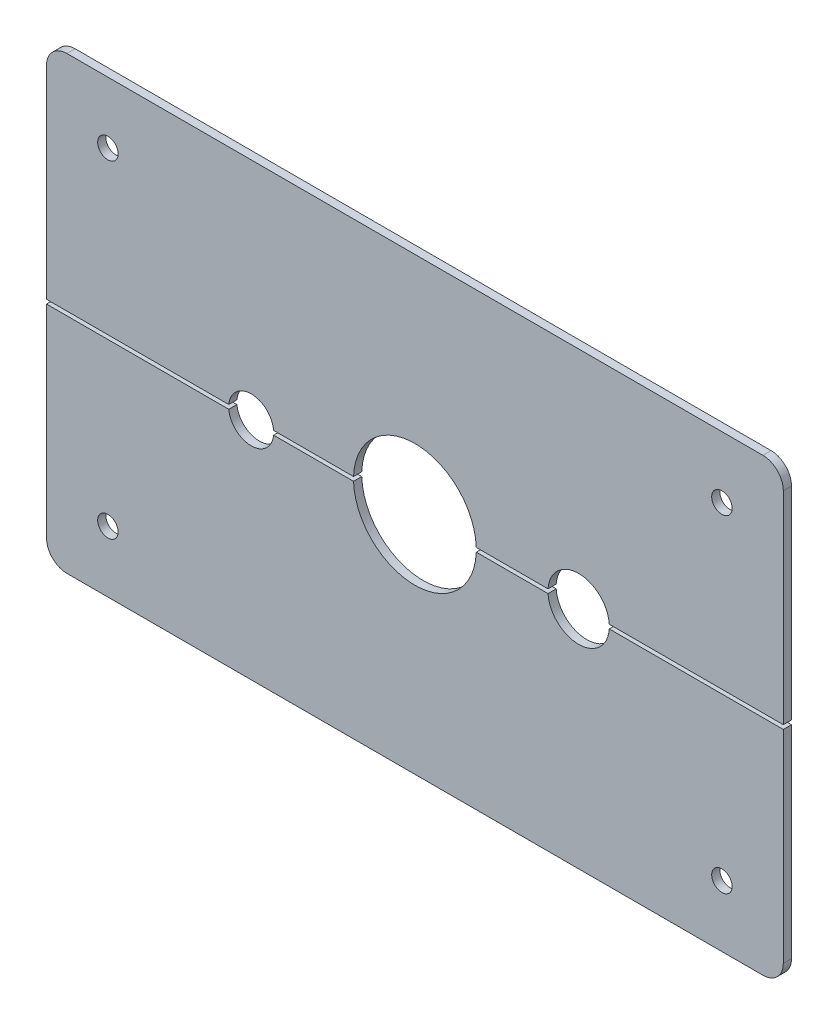
ISO-10303-21;
HEADER;
FILE_DESCRIPTION(('STEP AP214'),'2;1');
FILE_NAME('part.step','',(''),(''),'','','');
FILE_SCHEMA(('AUTOMOTIVE_DESIGN { 1 0 10303 214 1 1 1 1 }'));
ENDSEC;
DATA;
#1=APPLICATION_CONTEXT('core data for automotive mechanical design processes');
#2=APPLICATION_PROTOCOL_DEFINITION('international standard','automotive_design',2000,#1);
#3=PRODUCT_CONTEXT('',#1,'mechanical');
#4=PRODUCT('Part','Part','',(#3));
#5=PRODUCT_RELATED_PRODUCT_CATEGORY('part','',(#4));
#6=PRODUCT_DEFINITION_FORMATION('','',#4);
#7=PRODUCT_DEFINITION_CONTEXT('part definition',#1,'design');
#8=PRODUCT_DEFINITION('design','',#6,#7);
#9=PRODUCT_DEFINITION_SHAPE('','',#8);
#10=(LENGTH_UNIT() NAMED_UNIT(*) SI_UNIT(.MILLI.,.METRE.));
#11=(NAMED_UNIT(*) PLANE_ANGLE_UNIT() SI_UNIT($,.RADIAN.));
#12=(NAMED_UNIT(*) SI_UNIT($,.STERADIAN.) SOLID_ANGLE_UNIT());
#13=UNCERTAINTY_MEASURE_WITH_UNIT(LENGTH_MEASURE(1.E-05),#10,'distance_accuracy_value','');
#14=(GEOMETRIC_REPRESENTATION_CONTEXT(3) GLOBAL_UNCERTAINTY_ASSIGNED_CONTEXT((#13)) GLOBAL_UNIT_ASSIGNED_CONTEXT((#10,
#11,#12)) REPRESENTATION_CONTEXT('',''));
#15=CARTESIAN_POINT('',(0.,0.,0.));
#16=DIRECTION('',(0.,0.,1.));
#17=DIRECTION('',(1.,0.,0.));
#18=AXIS2_PLACEMENT_3D('',#15,#16,#17);
#19=CARTESIAN_POINT('',(-90.,-55.,-2.));
#20=DIRECTION('',(-1.,0.,0.));
#21=DIRECTION('',(0.,0.,1.));
#22=AXIS2_PLACEMENT_3D('',#19,#20,#21);
#23=PLANE('',#22);
#24=DIRECTION('',(0.,0.,1.));
#25=VECTOR('',#24,1.);
#26=CARTESIAN_POINT('',(-90.,-0.5,-2.));
#27=LINE('',#26,#25);
#28=CARTESIAN_POINT('',(-90.,-0.5,-2.));
#29=VERTEX_POINT('',#28);
#30=CARTESIAN_POINT('',(-90.,-0.5,0.));
#31=VERTEX_POINT('',#30);
#32=EDGE_CURVE('E192',#29,#31,#27,.T.);
#33=ORIENTED_EDGE('',*,*,#32,.F.);
#34=DIRECTION('',(0.,-1.,0.));
#35=VECTOR('',#34,1.);
#36=CARTESIAN_POINT('',(-90.,-55.,-2.));
#37=LINE('',#36,#35);
#38=CARTESIAN_POINT('',(-90.,-50.,-2.));
#39=VERTEX_POINT('',#38);
#40=EDGE_CURVE('E205',#29,#39,#37,.T.);
#41=ORIENTED_EDGE('',*,*,#40,.T.);
#42=DIRECTION('',(0.,0.,1.));
#43=VECTOR('',#42,1.);
#44=CARTESIAN_POINT('',(-90.,-50.,-2.));
#45=LINE('',#44,#43);
#46=CARTESIAN_POINT('',(-90.,-50.,0.));
#47=VERTEX_POINT('',#46);
#48=EDGE_CURVE('E147',#39,#47,#45,.T.);
#49=ORIENTED_EDGE('',*,*,#48,.T.);
#50=DIRECTION('',(0.,-1.,0.));
#51=VECTOR('',#50,1.);
#52=CARTESIAN_POINT('',(-90.,-55.,0.));
#53=LINE('',#52,#51);
#54=EDGE_CURVE('E167',#31,#47,#53,.T.);
#55=ORIENTED_EDGE('',*,*,#54,.F.);
#56=EDGE_LOOP('',(#33,#41,#49,#55));
#57=FACE_BOUND('',#56,.T.);
#58=ADVANCED_FACE('F49',(#57),#23,.T.);
#59=CARTESIAN_POINT('',(90.,-55.,-2.));
#60=DIRECTION('',(1.,0.,0.));
#61=DIRECTION('',(0.,0.,-1.));
#62=AXIS2_PLACEMENT_3D('',#59,#60,#61);
#63=PLANE('',#62);
#64=DIRECTION('',(0.,0.,-1.));
#65=VECTOR('',#64,1.);
#66=CARTESIAN_POINT('',(90.,-0.5,-2.));
#67=LINE('',#66,#65);
#68=CARTESIAN_POINT('',(89.9999999999999,-0.5,0.));
#69=VERTEX_POINT('',#68);
#70=CARTESIAN_POINT('',(90.,-0.5,-2.));
#71=VERTEX_POINT('',#70);
#72=EDGE_CURVE('E198',#69,#71,#67,.T.);
#73=ORIENTED_EDGE('',*,*,#72,.F.);
#74=DIRECTION('',(0.,1.,0.));
#75=VECTOR('',#74,1.);
#76=CARTESIAN_POINT('',(90.,-55.,0.));
#77=LINE('',#76,#75);
#78=CARTESIAN_POINT('',(90.,-50.,0.));
#79=VERTEX_POINT('',#78);
#80=EDGE_CURVE('E144',#79,#69,#77,.T.);
#81=ORIENTED_EDGE('',*,*,#80,.F.);
#82=DIRECTION('',(0.,0.,1.));
#83=VECTOR('',#82,1.);
#84=CARTESIAN_POINT('',(90.,-50.,-2.));
#85=LINE('',#84,#83);
#86=CARTESIAN_POINT('',(90.,-50.,-2.));
#87=VERTEX_POINT('',#86);
#88=EDGE_CURVE('E138',#79,#87,#85,.F.);
#89=ORIENTED_EDGE('',*,*,#88,.T.);
#90=DIRECTION('',(0.,1.,0.));
#91=VECTOR('',#90,1.);
#92=CARTESIAN_POINT('',(90.,-55.,-2.));
#93=LINE('',#92,#91);
#94=EDGE_CURVE('E142',#87,#71,#93,.T.);
#95=ORIENTED_EDGE('',*,*,#94,.T.);
#96=EDGE_LOOP('',(#73,#81,#89,#95));
#97=FACE_BOUND('',#96,.T.);
#98=ADVANCED_FACE('F141',(#97),#63,.T.);
#99=CARTESIAN_POINT('',(0.,0.,-2.));
#100=DIRECTION('',(0.,0.,1.));
#101=DIRECTION('',(1.,0.,0.));
#102=AXIS2_PLACEMENT_3D('',#99,#100,#101);
#103=PLANE('',#102);
#104=CARTESIAN_POINT('',(-75.,-40.,-2.));
#105=DIRECTION('',(0.,0.,1.));
#106=DIRECTION('',(1.,0.,0.));
#107=AXIS2_PLACEMENT_3D('',#104,#105,#106);
#108=CIRCLE('',#107,2.50000000000001);
#109=CARTESIAN_POINT('',(-72.5,-40.,-2.));
#110=VERTEX_POINT('',#109);
#111=EDGE_CURVE('E207',#110,#110,#108,.T.);
#112=ORIENTED_EDGE('',*,*,#111,.T.);
#113=EDGE_LOOP('',(#112));
#114=FACE_BOUND('',#113,.T.);
#115=CARTESIAN_POINT('',(75.,-40.,-2.));
#116=DIRECTION('',(0.,0.,1.));
#117=DIRECTION('',(1.,0.,0.));
#118=AXIS2_PLACEMENT_3D('',#115,#116,#117);
#119=CIRCLE('',#118,2.5);
#120=CARTESIAN_POINT('',(77.5,-40.,-2.));
#121=VERTEX_POINT('',#120);
#122=EDGE_CURVE('E256',#121,#121,#119,.T.);
#123=ORIENTED_EDGE('',*,*,#122,.T.);
#124=EDGE_LOOP('',(#123));
#125=FACE_BOUND('',#124,.T.);
#126=ORIENTED_EDGE('',*,*,#40,.F.);
#127=DIRECTION('',(1.,0.,0.));
#128=VECTOR('',#127,1.);
#129=CARTESIAN_POINT('',(0.,-0.5,-2.));
#130=LINE('',#129,#128);
#131=CARTESIAN_POINT('',(-45.4772255750517,-0.5,-2.));
#132=VERTEX_POINT('',#131);
#133=EDGE_CURVE('E158',#29,#132,#130,.T.);
#134=ORIENTED_EDGE('',*,*,#133,.T.);
#135=CARTESIAN_POINT('',(-40.,0.,-2.));
#136=DIRECTION('',(0.,0.,1.));
#137=DIRECTION('',(1.,0.,0.));
#138=AXIS2_PLACEMENT_3D('',#135,#136,#137);
#139=CIRCLE('',#138,5.5);
#140=CARTESIAN_POINT('',(-34.5227744249483,-0.5,-2.));
#141=VERTEX_POINT('',#140);
#142=EDGE_CURVE('E211',#132,#141,#139,.T.);
#143=ORIENTED_EDGE('',*,*,#142,.T.);
#144=CARTESIAN_POINT('',(-14.9916643505649,-0.5,-2.));
#145=VERTEX_POINT('',#144);
#146=EDGE_CURVE('E107',#141,#145,#130,.T.);
#147=ORIENTED_EDGE('',*,*,#146,.T.);
#148=CARTESIAN_POINT('',(0.,0.,-2.));
#149=DIRECTION('',(0.,0.,1.));
#150=DIRECTION('',(1.,0.,0.));
#151=AXIS2_PLACEMENT_3D('',#148,#149,#150);
#152=CIRCLE('',#151,15.);
#153=CARTESIAN_POINT('',(14.9916643505649,-0.5,-2.));
#154=VERTEX_POINT('',#153);
#155=EDGE_CURVE('E203',#145,#154,#152,.T.);
#156=ORIENTED_EDGE('',*,*,#155,.T.);
#157=CARTESIAN_POINT('',(32.5166852264521,-0.5,-2.));
#158=VERTEX_POINT('',#157);
#159=EDGE_CURVE('E171',#154,#158,#130,.T.);
#160=ORIENTED_EDGE('',*,*,#159,.T.);
#161=CARTESIAN_POINT('',(40.,0.,-2.));
#162=DIRECTION('',(0.,0.,1.));
#163=DIRECTION('',(1.,0.,0.));
#164=AXIS2_PLACEMENT_3D('',#161,#162,#163);
#165=CIRCLE('',#164,7.5);
#166=CARTESIAN_POINT('',(47.4833147735479,-0.5,-2.));
#167=VERTEX_POINT('',#166);
#168=EDGE_CURVE('E169',#158,#167,#165,.T.);
#169=ORIENTED_EDGE('',*,*,#168,.T.);
#170=EDGE_CURVE('E157',#167,#71,#130,.T.);
#171=ORIENTED_EDGE('',*,*,#170,.T.);
#172=ORIENTED_EDGE('',*,*,#94,.F.);
#173=CARTESIAN_POINT('',(85.,-50.,-2.));
#174=DIRECTION('',(0.,0.,1.));
#175=DIRECTION('',(1.,0.,0.));
#176=AXIS2_PLACEMENT_3D('',#173,#174,#175);
#177=CIRCLE('',#176,5.);
#178=CARTESIAN_POINT('',(85.,-55.,-2.));
#179=VERTEX_POINT('',#178);
#180=EDGE_CURVE('E154',#87,#179,#177,.F.);
#181=ORIENTED_EDGE('',*,*,#180,.T.);
#182=DIRECTION('',(1.,0.,0.));
#183=VECTOR('',#182,1.);
#184=CARTESIAN_POINT('',(90.,-55.,-2.));
#185=LINE('',#184,#183);
#186=CARTESIAN_POINT('',(-84.9999999999999,-55.,-2.));
#187=VERTEX_POINT('',#186);
#188=EDGE_CURVE('E184',#187,#179,#185,.T.);
#189=ORIENTED_EDGE('',*,*,#188,.F.);
#190=CARTESIAN_POINT('',(-85.,-50.,-2.));
#191=DIRECTION('',(0.,0.,1.));
#192=DIRECTION('',(1.,0.,0.));
#193=AXIS2_PLACEMENT_3D('',#190,#191,#192);
#194=CIRCLE('',#193,5.);
#195=EDGE_CURVE('E164',#187,#39,#194,.F.);
#196=ORIENTED_EDGE('',*,*,#195,.T.);
#197=EDGE_LOOP('',(#126,#134,#143,#147,#156,#160,#169,#171,#172,#181,#189,#196));
#198=FACE_BOUND('',#197,.T.);
#199=ADVANCED_FACE('F152',(#114,#125,#198),#103,.F.);
#200=CARTESIAN_POINT('',(0.,0.,0.));
#201=DIRECTION('',(0.,0.,1.));
#202=DIRECTION('',(1.,0.,0.));
#203=AXIS2_PLACEMENT_3D('',#200,#201,#202);
#204=PLANE('',#203);
#205=CARTESIAN_POINT('',(-75.,-40.,0.));
#206=DIRECTION('',(0.,0.,1.));
#207=DIRECTION('',(1.,0.,0.));
#208=AXIS2_PLACEMENT_3D('',#205,#206,#207);
#209=CIRCLE('',#208,2.50000000000001);
#210=CARTESIAN_POINT('',(-72.5,-40.,0.));
#211=VERTEX_POINT('',#210);
#212=EDGE_CURVE('E259',#211,#211,#209,.T.);
#213=ORIENTED_EDGE('',*,*,#212,.F.);
#214=EDGE_LOOP('',(#213));
#215=FACE_BOUND('',#214,.T.);
#216=CARTESIAN_POINT('',(75.,-40.,0.));
#217=DIRECTION('',(0.,0.,1.));
#218=DIRECTION('',(1.,0.,0.));
#219=AXIS2_PLACEMENT_3D('',#216,#217,#218);
#220=CIRCLE('',#219,2.5);
#221=CARTESIAN_POINT('',(77.5,-40.,0.));
#222=VERTEX_POINT('',#221);
#223=EDGE_CURVE('E260',#222,#222,#220,.T.);
#224=ORIENTED_EDGE('',*,*,#223,.F.);
#225=EDGE_LOOP('',(#224));
#226=FACE_BOUND('',#225,.T.);
#227=DIRECTION('',(1.,0.,0.));
#228=VECTOR('',#227,1.);
#229=CARTESIAN_POINT('',(-112.239777966295,-0.5,0.));
#230=LINE('',#229,#228);
#231=CARTESIAN_POINT('',(-45.4772255750517,-0.5,0.));
#232=VERTEX_POINT('',#231);
#233=EDGE_CURVE('E58',#31,#232,#230,.T.);
#234=ORIENTED_EDGE('',*,*,#233,.F.);
#235=ORIENTED_EDGE('',*,*,#54,.T.);
#236=CARTESIAN_POINT('',(-85.,-50.,0.));
#237=DIRECTION('',(0.,0.,1.));
#238=DIRECTION('',(1.,0.,0.));
#239=AXIS2_PLACEMENT_3D('',#236,#237,#238);
#240=CIRCLE('',#239,5.);
#241=CARTESIAN_POINT('',(-84.9999999999999,-55.,0.));
#242=VERTEX_POINT('',#241);
#243=EDGE_CURVE('E180',#47,#242,#240,.T.);
#244=ORIENTED_EDGE('',*,*,#243,.T.);
#245=DIRECTION('',(1.,0.,0.));
#246=VECTOR('',#245,1.);
#247=CARTESIAN_POINT('',(90.,-55.,0.));
#248=LINE('',#247,#246);
#249=CARTESIAN_POINT('',(85.,-55.,0.));
#250=VERTEX_POINT('',#249);
#251=EDGE_CURVE('E179',#242,#250,#248,.T.);
#252=ORIENTED_EDGE('',*,*,#251,.T.);
#253=CARTESIAN_POINT('',(85.,-50.,0.));
#254=DIRECTION('',(0.,0.,1.));
#255=DIRECTION('',(1.,0.,0.));
#256=AXIS2_PLACEMENT_3D('',#253,#254,#255);
#257=CIRCLE('',#256,5.);
#258=EDGE_CURVE('E176',#250,#79,#257,.T.);
#259=ORIENTED_EDGE('',*,*,#258,.T.);
#260=ORIENTED_EDGE('',*,*,#80,.T.);
#261=CARTESIAN_POINT('',(47.4833147735479,-0.5,0.));
#262=VERTEX_POINT('',#261);
#263=EDGE_CURVE('E195',#262,#69,#230,.T.);
#264=ORIENTED_EDGE('',*,*,#263,.F.);
#265=CARTESIAN_POINT('',(40.,0.,0.));
#266=DIRECTION('',(0.,0.,1.));
#267=DIRECTION('',(1.,0.,0.));
#268=AXIS2_PLACEMENT_3D('',#265,#266,#267);
#269=CIRCLE('',#268,7.5);
#270=CARTESIAN_POINT('',(32.5166852264521,-0.499999999999999,0.));
#271=VERTEX_POINT('',#270);
#272=EDGE_CURVE('E52',#271,#262,#269,.T.);
#273=ORIENTED_EDGE('',*,*,#272,.F.);
#274=CARTESIAN_POINT('',(14.9916643505649,-0.5,0.));
#275=VERTEX_POINT('',#274);
#276=EDGE_CURVE('E60',#275,#271,#230,.T.);
#277=ORIENTED_EDGE('',*,*,#276,.F.);
#278=CARTESIAN_POINT('',(0.,0.,0.));
#279=DIRECTION('',(0.,0.,1.));
#280=DIRECTION('',(1.,0.,0.));
#281=AXIS2_PLACEMENT_3D('',#278,#279,#280);
#282=CIRCLE('',#281,15.);
#283=CARTESIAN_POINT('',(-14.9916643505649,-0.5,0.));
#284=VERTEX_POINT('',#283);
#285=EDGE_CURVE('E201',#284,#275,#282,.T.);
#286=ORIENTED_EDGE('',*,*,#285,.F.);
#287=CARTESIAN_POINT('',(-34.5227744249483,-0.5,0.));
#288=VERTEX_POINT('',#287);
#289=EDGE_CURVE('E12',#288,#284,#230,.T.);
#290=ORIENTED_EDGE('',*,*,#289,.F.);
#291=CARTESIAN_POINT('',(-40.,0.,0.));
#292=DIRECTION('',(0.,0.,1.));
#293=DIRECTION('',(1.,0.,0.));
#294=AXIS2_PLACEMENT_3D('',#291,#292,#293);
#295=CIRCLE('',#294,5.5);
#296=EDGE_CURVE('E188',#232,#288,#295,.T.);
#297=ORIENTED_EDGE('',*,*,#296,.F.);
#298=EDGE_LOOP('',(#234,#235,#244,#252,#259,#260,#264,#273,#277,#286,#290,#297));
#299=FACE_BOUND('',#298,.T.);
#300=ADVANCED_FACE('F224',(#215,#226,#299),#204,.T.);
#301=CARTESIAN_POINT('',(0.,0.,-10.));
#302=DIRECTION('',(0.,0.,1.));
#303=DIRECTION('',(1.,0.,0.));
#304=AXIS2_PLACEMENT_3D('',#301,#302,#303);
#305=CYLINDRICAL_SURFACE('',#304,15.);
#306=ORIENTED_EDGE('',*,*,#285,.T.);
#307=DIRECTION('',(0.,0.,1.));
#308=VECTOR('',#307,1.);
#309=CARTESIAN_POINT('',(14.9916643505649,-0.5,-10.));
#310=LINE('',#309,#308);
#311=EDGE_CURVE('E189',#275,#154,#310,.F.);
#312=ORIENTED_EDGE('',*,*,#311,.T.);
#313=ORIENTED_EDGE('',*,*,#155,.F.);
#314=DIRECTION('',(0.,0.,1.));
#315=VECTOR('',#314,1.);
#316=CARTESIAN_POINT('',(-14.9916643505649,-0.5,-10.));
#317=LINE('',#316,#315);
#318=EDGE_CURVE('E67',#145,#284,#317,.T.);
#319=ORIENTED_EDGE('',*,*,#318,.T.);
#320=EDGE_LOOP('',(#306,#312,#313,#319));
#321=FACE_BOUND('',#320,.T.);
#322=ADVANCED_FACE('F231',(#321),#305,.F.);
#323=CARTESIAN_POINT('',(-40.,0.,-10.));
#324=DIRECTION('',(0.,0.,1.));
#325=DIRECTION('',(1.,0.,0.));
#326=AXIS2_PLACEMENT_3D('',#323,#324,#325);
#327=CYLINDRICAL_SURFACE('',#326,5.5);
#328=ORIENTED_EDGE('',*,*,#296,.T.);
#329=DIRECTION('',(0.,0.,1.));
#330=VECTOR('',#329,1.);
#331=CARTESIAN_POINT('',(-34.5227744249483,-0.5,-10.));
#332=LINE('',#331,#330);
#333=EDGE_CURVE('E104',#288,#141,#332,.F.);
#334=ORIENTED_EDGE('',*,*,#333,.T.);
#335=ORIENTED_EDGE('',*,*,#142,.F.);
#336=DIRECTION('',(0.,0.,1.));
#337=VECTOR('',#336,1.);
#338=CARTESIAN_POINT('',(-45.4772255750517,-0.5,-10.));
#339=LINE('',#338,#337);
#340=EDGE_CURVE('E191',#132,#232,#339,.T.);
#341=ORIENTED_EDGE('',*,*,#340,.T.);
#342=EDGE_LOOP('',(#328,#334,#335,#341));
#343=FACE_BOUND('',#342,.T.);
#344=ADVANCED_FACE('F220',(#343),#327,.F.);
#345=CARTESIAN_POINT('',(40.,0.,-10.));
#346=DIRECTION('',(0.,0.,1.));
#347=DIRECTION('',(1.,0.,0.));
#348=AXIS2_PLACEMENT_3D('',#345,#346,#347);
#349=CYLINDRICAL_SURFACE('',#348,7.5);
#350=ORIENTED_EDGE('',*,*,#272,.T.);
#351=DIRECTION('',(0.,0.,1.));
#352=VECTOR('',#351,1.);
#353=CARTESIAN_POINT('',(47.4833147735479,-0.5,-10.));
#354=LINE('',#353,#352);
#355=EDGE_CURVE('E251',#262,#167,#354,.F.);
#356=ORIENTED_EDGE('',*,*,#355,.T.);
#357=ORIENTED_EDGE('',*,*,#168,.F.);
#358=DIRECTION('',(0.,0.,1.));
#359=VECTOR('',#358,1.);
#360=CARTESIAN_POINT('',(32.5166852264521,-0.5,-10.));
#361=LINE('',#360,#359);
#362=EDGE_CURVE('E186',#158,#271,#361,.T.);
#363=ORIENTED_EDGE('',*,*,#362,.T.);
#364=EDGE_LOOP('',(#350,#356,#357,#363));
#365=FACE_BOUND('',#364,.T.);
#366=ADVANCED_FACE('F312',(#365),#349,.F.);
#367=CARTESIAN_POINT('',(90.,-55.,-2.));
#368=DIRECTION('',(0.,-1.,0.));
#369=DIRECTION('',(1.,0.,0.));
#370=AXIS2_PLACEMENT_3D('',#367,#368,#369);
#371=PLANE('',#370);
#372=ORIENTED_EDGE('',*,*,#188,.T.);
#373=DIRECTION('',(0.,0.,1.));
#374=VECTOR('',#373,1.);
#375=CARTESIAN_POINT('',(85.,-55.,-2.));
#376=LINE('',#375,#374);
#377=EDGE_CURVE('E163',#179,#250,#376,.T.);
#378=ORIENTED_EDGE('',*,*,#377,.T.);
#379=ORIENTED_EDGE('',*,*,#251,.F.);
#380=DIRECTION('',(0.,0.,1.));
#381=VECTOR('',#380,1.);
#382=CARTESIAN_POINT('',(-85.,-55.,-2.));
#383=LINE('',#382,#381);
#384=EDGE_CURVE('E173',#242,#187,#383,.F.);
#385=ORIENTED_EDGE('',*,*,#384,.T.);
#386=EDGE_LOOP('',(#372,#378,#379,#385));
#387=FACE_BOUND('',#386,.T.);
#388=ADVANCED_FACE('F321',(#387),#371,.T.);
#389=CARTESIAN_POINT('',(85.,-50.,-2.));
#390=DIRECTION('',(0.,0.,1.));
#391=DIRECTION('',(1.,0.,0.));
#392=AXIS2_PLACEMENT_3D('',#389,#390,#391);
#393=CYLINDRICAL_SURFACE('',#392,5.);
#394=ORIENTED_EDGE('',*,*,#180,.F.);
#395=ORIENTED_EDGE('',*,*,#88,.F.);
#396=ORIENTED_EDGE('',*,*,#258,.F.);
#397=ORIENTED_EDGE('',*,*,#377,.F.);
#398=EDGE_LOOP('',(#394,#395,#396,#397));
#399=FACE_BOUND('',#398,.T.);
#400=ADVANCED_FACE('F161',(#399),#393,.T.);
#401=CARTESIAN_POINT('',(-85.,-50.,-2.));
#402=DIRECTION('',(0.,0.,1.));
#403=DIRECTION('',(1.,0.,0.));
#404=AXIS2_PLACEMENT_3D('',#401,#402,#403);
#405=CYLINDRICAL_SURFACE('',#404,5.);
#406=ORIENTED_EDGE('',*,*,#195,.F.);
#407=ORIENTED_EDGE('',*,*,#384,.F.);
#408=ORIENTED_EDGE('',*,*,#243,.F.);
#409=ORIENTED_EDGE('',*,*,#48,.F.);
#410=EDGE_LOOP('',(#406,#407,#408,#409));
#411=FACE_BOUND('',#410,.T.);
#412=ADVANCED_FACE('F245',(#411),#405,.T.);
#413=CARTESIAN_POINT('',(-112.239777966295,-0.5,-10.));
#414=DIRECTION('',(0.,-1.,0.));
#415=DIRECTION('',(0.,0.,-1.));
#416=AXIS2_PLACEMENT_3D('',#413,#414,#415);
#417=PLANE('',#416);
#418=ORIENTED_EDGE('',*,*,#276,.T.);
#419=ORIENTED_EDGE('',*,*,#362,.F.);
#420=ORIENTED_EDGE('',*,*,#159,.F.);
#421=ORIENTED_EDGE('',*,*,#311,.F.);
#422=EDGE_LOOP('',(#418,#419,#420,#421));
#423=FACE_BOUND('',#422,.T.);
#424=ADVANCED_FACE('F348',(#423),#417,.F.);
#425=ORIENTED_EDGE('',*,*,#72,.T.);
#426=ORIENTED_EDGE('',*,*,#170,.F.);
#427=ORIENTED_EDGE('',*,*,#355,.F.);
#428=ORIENTED_EDGE('',*,*,#263,.T.);
#429=EDGE_LOOP('',(#425,#426,#427,#428));
#430=FACE_BOUND('',#429,.T.);
#431=ADVANCED_FACE('F357',(#430),#417,.F.);
#432=ORIENTED_EDGE('',*,*,#32,.T.);
#433=ORIENTED_EDGE('',*,*,#233,.T.);
#434=ORIENTED_EDGE('',*,*,#340,.F.);
#435=ORIENTED_EDGE('',*,*,#133,.F.);
#436=EDGE_LOOP('',(#432,#433,#434,#435));
#437=FACE_BOUND('',#436,.T.);
#438=ADVANCED_FACE('F236',(#437),#417,.F.);
#439=ORIENTED_EDGE('',*,*,#146,.F.);
#440=ORIENTED_EDGE('',*,*,#333,.F.);
#441=ORIENTED_EDGE('',*,*,#289,.T.);
#442=ORIENTED_EDGE('',*,*,#318,.F.);
#443=EDGE_LOOP('',(#439,#440,#441,#442));
#444=FACE_BOUND('',#443,.T.);
#445=ADVANCED_FACE('F228',(#444),#417,.F.);
#446=CARTESIAN_POINT('',(75.,-40.,-10.));
#447=DIRECTION('',(0.,0.,1.));
#448=DIRECTION('',(1.,0.,0.));
#449=AXIS2_PLACEMENT_3D('',#446,#447,#448);
#450=CYLINDRICAL_SURFACE('',#449,2.5);
#451=ORIENTED_EDGE('',*,*,#223,.T.);
#452=EDGE_LOOP('',(#451));
#453=FACE_BOUND('',#452,.T.);
#454=ORIENTED_EDGE('',*,*,#122,.F.);
#455=EDGE_LOOP('',(#454));
#456=FACE_BOUND('',#455,.T.);
#457=ADVANCED_FACE('F274',(#453,#456),#450,.F.);
#458=CARTESIAN_POINT('',(-75.,-40.,-10.));
#459=DIRECTION('',(0.,0.,1.));
#460=DIRECTION('',(1.,0.,0.));
#461=AXIS2_PLACEMENT_3D('',#458,#459,#460);
#462=CYLINDRICAL_SURFACE('',#461,2.50000000000001);
#463=ORIENTED_EDGE('',*,*,#212,.T.);
#464=EDGE_LOOP('',(#463));
#465=FACE_BOUND('',#464,.T.);
#466=ORIENTED_EDGE('',*,*,#111,.F.);
#467=EDGE_LOOP('',(#466));
#468=FACE_BOUND('',#467,.T.);
#469=ADVANCED_FACE('F266',(#465,#468),#462,.F.);
#470=CLOSED_SHELL('',(#58,#98,#199,#300,#322,#344,#366,#388,#400,#412,#424,#431,#438,#445,#457,#469));
#471=MANIFOLD_SOLID_BREP('B2',#470);
#472=CARTESIAN_POINT('',(-85.,50.,-2.));
#473=DIRECTION('',(0.,0.,1.));
#474=DIRECTION('',(1.,0.,0.));
#475=AXIS2_PLACEMENT_3D('',#472,#473,#474);
#476=CYLINDRICAL_SURFACE('',#475,5.);
#477=CARTESIAN_POINT('',(-85.,50.,-2.));
#478=DIRECTION('',(0.,0.,1.));
#479=DIRECTION('',(1.,0.,0.));
#480=AXIS2_PLACEMENT_3D('',#477,#478,#479);
#481=CIRCLE('',#480,5.);
#482=CARTESIAN_POINT('',(-90.,50.,-2.));
#483=VERTEX_POINT('',#482);
#484=CARTESIAN_POINT('',(-84.9999999999999,55.,-2.));
#485=VERTEX_POINT('',#484);
#486=EDGE_CURVE('E576',#483,#485,#481,.F.);
#487=ORIENTED_EDGE('',*,*,#486,.F.);
#488=DIRECTION('',(0.,0.,1.));
#489=VECTOR('',#488,1.);
#490=CARTESIAN_POINT('',(-90.,50.,-2.));
#491=LINE('',#490,#489);
#492=CARTESIAN_POINT('',(-90.,50.,0.));
#493=VERTEX_POINT('',#492);
#494=EDGE_CURVE('E581',#493,#483,#491,.F.);
#495=ORIENTED_EDGE('',*,*,#494,.F.);
#496=CARTESIAN_POINT('',(-85.,50.,0.));
#497=DIRECTION('',(0.,0.,1.));
#498=DIRECTION('',(1.,0.,0.));
#499=AXIS2_PLACEMENT_3D('',#496,#497,#498);
#500=CIRCLE('',#499,5.);
#501=CARTESIAN_POINT('',(-84.9999999999999,55.,0.));
#502=VERTEX_POINT('',#501);
#503=EDGE_CURVE('E566',#502,#493,#500,.T.);
#504=ORIENTED_EDGE('',*,*,#503,.F.);
#505=DIRECTION('',(0.,0.,1.));
#506=VECTOR('',#505,1.);
#507=CARTESIAN_POINT('',(-85.,55.,-2.));
#508=LINE('',#507,#506);
#509=EDGE_CURVE('E571',#485,#502,#508,.T.);
#510=ORIENTED_EDGE('',*,*,#509,.F.);
#511=EDGE_LOOP('',(#487,#495,#504,#510));
#512=FACE_BOUND('',#511,.T.);
#513=ADVANCED_FACE('F438',(#512),#476,.T.);
#514=CARTESIAN_POINT('',(90.,55.,-2.));
#515=DIRECTION('',(0.,1.,0.));
#516=DIRECTION('',(-1.,0.,0.));
#517=AXIS2_PLACEMENT_3D('',#514,#515,#516);
#518=PLANE('',#517);
#519=DIRECTION('',(-1.,0.,0.));
#520=VECTOR('',#519,1.);
#521=CARTESIAN_POINT('',(90.,55.,0.));
#522=LINE('',#521,#520);
#523=CARTESIAN_POINT('',(85.,55.,0.));
#524=VERTEX_POINT('',#523);
#525=EDGE_CURVE('E554',#524,#502,#522,.T.);
#526=ORIENTED_EDGE('',*,*,#525,.F.);
#527=DIRECTION('',(0.,0.,1.));
#528=VECTOR('',#527,1.);
#529=CARTESIAN_POINT('',(85.,55.,-2.));
#530=LINE('',#529,#528);
#531=CARTESIAN_POINT('',(85.,55.,-2.));
#532=VERTEX_POINT('',#531);
#533=EDGE_CURVE('E574',#524,#532,#530,.F.);
#534=ORIENTED_EDGE('',*,*,#533,.T.);
#535=DIRECTION('',(-1.,0.,0.));
#536=VECTOR('',#535,1.);
#537=CARTESIAN_POINT('',(90.,55.,-2.));
#538=LINE('',#537,#536);
#539=EDGE_CURVE('E567',#532,#485,#538,.T.);
#540=ORIENTED_EDGE('',*,*,#539,.T.);
#541=ORIENTED_EDGE('',*,*,#509,.T.);
#542=EDGE_LOOP('',(#526,#534,#540,#541));
#543=FACE_BOUND('',#542,.T.);
#544=ADVANCED_FACE('F634',(#543),#518,.T.);
#545=CARTESIAN_POINT('',(85.,50.,-2.));
#546=DIRECTION('',(0.,0.,1.));
#547=DIRECTION('',(1.,0.,0.));
#548=AXIS2_PLACEMENT_3D('',#545,#546,#547);
#549=CYLINDRICAL_SURFACE('',#548,5.);
#550=CARTESIAN_POINT('',(85.,50.,-2.));
#551=DIRECTION('',(0.,0.,1.));
#552=DIRECTION('',(1.,0.,0.));
#553=AXIS2_PLACEMENT_3D('',#550,#551,#552);
#554=CIRCLE('',#553,5.);
#555=CARTESIAN_POINT('',(90.,50.,-2.));
#556=VERTEX_POINT('',#555);
#557=EDGE_CURVE('E578',#532,#556,#554,.F.);
#558=ORIENTED_EDGE('',*,*,#557,.F.);
#559=ORIENTED_EDGE('',*,*,#533,.F.);
#560=CARTESIAN_POINT('',(85.,50.,0.));
#561=DIRECTION('',(0.,0.,1.));
#562=DIRECTION('',(1.,0.,0.));
#563=AXIS2_PLACEMENT_3D('',#560,#561,#562);
#564=CIRCLE('',#563,5.);
#565=CARTESIAN_POINT('',(90.,50.,0.));
#566=VERTEX_POINT('',#565);
#567=EDGE_CURVE('E569',#566,#524,#564,.T.);
#568=ORIENTED_EDGE('',*,*,#567,.F.);
#569=DIRECTION('',(0.,0.,1.));
#570=VECTOR('',#569,1.);
#571=CARTESIAN_POINT('',(90.,50.,-2.));
#572=LINE('',#571,#570);
#573=EDGE_CURVE('E553',#556,#566,#572,.T.);
#574=ORIENTED_EDGE('',*,*,#573,.F.);
#575=EDGE_LOOP('',(#558,#559,#568,#574));
#576=FACE_BOUND('',#575,.T.);
#577=ADVANCED_FACE('F664',(#576),#549,.T.);
#578=CARTESIAN_POINT('',(40.,0.,-10.));
#579=DIRECTION('',(0.,0.,1.));
#580=DIRECTION('',(1.,0.,0.));
#581=AXIS2_PLACEMENT_3D('',#578,#579,#580);
#582=CYLINDRICAL_SURFACE('',#581,7.5);
#583=CARTESIAN_POINT('',(40.,0.,0.));
#584=DIRECTION('',(0.,0.,1.));
#585=DIRECTION('',(1.,0.,0.));
#586=AXIS2_PLACEMENT_3D('',#583,#584,#585);
#587=CIRCLE('',#586,7.5);
#588=CARTESIAN_POINT('',(47.4833147735479,0.5,0.));
#589=VERTEX_POINT('',#588);
#590=CARTESIAN_POINT('',(32.5166852264521,0.5,0.));
#591=VERTEX_POINT('',#590);
#592=EDGE_CURVE('E546',#589,#591,#587,.T.);
#593=ORIENTED_EDGE('',*,*,#592,.T.);
#594=DIRECTION('',(0.,0.,1.));
#595=VECTOR('',#594,1.);
#596=CARTESIAN_POINT('',(32.5166852264521,0.5,-10.));
#597=LINE('',#596,#595);
#598=CARTESIAN_POINT('',(32.5166852264521,0.5,-2.));
#599=VERTEX_POINT('',#598);
#600=EDGE_CURVE('E47',#591,#599,#597,.F.);
#601=ORIENTED_EDGE('',*,*,#600,.T.);
#602=CARTESIAN_POINT('',(40.,0.,-2.));
#603=DIRECTION('',(0.,0.,1.));
#604=DIRECTION('',(1.,0.,0.));
#605=AXIS2_PLACEMENT_3D('',#602,#603,#604);
#606=CIRCLE('',#605,7.5);
#607=CARTESIAN_POINT('',(47.4833147735479,0.5,-2.));
#608=VERTEX_POINT('',#607);
#609=EDGE_CURVE('E561',#608,#599,#606,.T.);
#610=ORIENTED_EDGE('',*,*,#609,.F.);
#611=DIRECTION('',(0.,0.,1.));
#612=VECTOR('',#611,1.);
#613=CARTESIAN_POINT('',(47.4833147735479,0.5,-10.));
#614=LINE('',#613,#612);
#615=EDGE_CURVE('E446',#608,#589,#614,.T.);
#616=ORIENTED_EDGE('',*,*,#615,.T.);
#617=EDGE_LOOP('',(#593,#601,#610,#616));
#618=FACE_BOUND('',#617,.T.);
#619=ADVANCED_FACE('F662',(#618),#582,.F.);
#620=CARTESIAN_POINT('',(0.,0.,-10.));
#621=DIRECTION('',(0.,0.,1.));
#622=DIRECTION('',(1.,0.,0.));
#623=AXIS2_PLACEMENT_3D('',#620,#621,#622);
#624=CYLINDRICAL_SURFACE('',#623,15.);
#625=CARTESIAN_POINT('',(0.,0.,0.));
#626=DIRECTION('',(0.,0.,1.));
#627=DIRECTION('',(1.,0.,0.));
#628=AXIS2_PLACEMENT_3D('',#625,#626,#627);
#629=CIRCLE('',#628,15.);
#630=CARTESIAN_POINT('',(14.9916643505649,0.5,0.));
#631=VERTEX_POINT('',#630);
#632=CARTESIAN_POINT('',(-14.9916643505649,0.5,0.));
#633=VERTEX_POINT('',#632);
#634=EDGE_CURVE('E614',#631,#633,#629,.T.);
#635=ORIENTED_EDGE('',*,*,#634,.T.);
#636=DIRECTION('',(0.,0.,1.));
#637=VECTOR('',#636,1.);
#638=CARTESIAN_POINT('',(-14.9916643505649,0.5,-10.));
#639=LINE('',#638,#637);
#640=CARTESIAN_POINT('',(-14.9916643505649,0.5,-2.));
#641=VERTEX_POINT('',#640);
#642=EDGE_CURVE('E604',#633,#641,#639,.F.);
#643=ORIENTED_EDGE('',*,*,#642,.T.);
#644=CARTESIAN_POINT('',(0.,0.,-2.));
#645=DIRECTION('',(0.,0.,1.));
#646=DIRECTION('',(1.,0.,0.));
#647=AXIS2_PLACEMENT_3D('',#644,#645,#646);
#648=CIRCLE('',#647,15.);
#649=CARTESIAN_POINT('',(14.9916643505649,0.5,-2.));
#650=VERTEX_POINT('',#649);
#651=EDGE_CURVE('E618',#650,#641,#648,.T.);
#652=ORIENTED_EDGE('',*,*,#651,.F.);
#653=DIRECTION('',(0.,0.,1.));
#654=VECTOR('',#653,1.);
#655=CARTESIAN_POINT('',(14.9916643505649,0.5,-10.));
#656=LINE('',#655,#654);
#657=EDGE_CURVE('E598',#650,#631,#656,.T.);
#658=ORIENTED_EDGE('',*,*,#657,.T.);
#659=EDGE_LOOP('',(#635,#643,#652,#658));
#660=FACE_BOUND('',#659,.T.);
#661=ADVANCED_FACE('F656',(#660),#624,.F.);
#662=CARTESIAN_POINT('',(-40.,0.,-10.));
#663=DIRECTION('',(0.,0.,1.));
#664=DIRECTION('',(1.,0.,0.));
#665=AXIS2_PLACEMENT_3D('',#662,#663,#664);
#666=CYLINDRICAL_SURFACE('',#665,5.5);
#667=CARTESIAN_POINT('',(-40.,0.,0.));
#668=DIRECTION('',(0.,0.,1.));
#669=DIRECTION('',(1.,0.,0.));
#670=AXIS2_PLACEMENT_3D('',#667,#668,#669);
#671=CIRCLE('',#670,5.5);
#672=CARTESIAN_POINT('',(-34.5227744249483,0.5,0.));
#673=VERTEX_POINT('',#672);
#674=CARTESIAN_POINT('',(-45.4772255750517,0.5,0.));
#675=VERTEX_POINT('',#674);
#676=EDGE_CURVE('E611',#673,#675,#671,.T.);
#677=ORIENTED_EDGE('',*,*,#676,.T.);
#678=DIRECTION('',(0.,0.,1.));
#679=VECTOR('',#678,1.);
#680=CARTESIAN_POINT('',(-45.4772255750517,0.5,-10.));
#681=LINE('',#680,#679);
#682=CARTESIAN_POINT('',(-45.4772255750517,0.5,-2.));
#683=VERTEX_POINT('',#682);
#684=EDGE_CURVE('E607',#675,#683,#681,.F.);
#685=ORIENTED_EDGE('',*,*,#684,.T.);
#686=CARTESIAN_POINT('',(-40.,0.,-2.));
#687=DIRECTION('',(0.,0.,1.));
#688=DIRECTION('',(1.,0.,0.));
#689=AXIS2_PLACEMENT_3D('',#686,#687,#688);
#690=CIRCLE('',#689,5.5);
#691=CARTESIAN_POINT('',(-34.5227744249483,0.5,-2.));
#692=VERTEX_POINT('',#691);
#693=EDGE_CURVE('E621',#692,#683,#690,.T.);
#694=ORIENTED_EDGE('',*,*,#693,.F.);
#695=DIRECTION('',(0.,0.,1.));
#696=VECTOR('',#695,1.);
#697=CARTESIAN_POINT('',(-34.5227744249483,0.5,-10.));
#698=LINE('',#697,#696);
#699=EDGE_CURVE('E601',#692,#673,#698,.T.);
#700=ORIENTED_EDGE('',*,*,#699,.T.);
#701=EDGE_LOOP('',(#677,#685,#694,#700));
#702=FACE_BOUND('',#701,.T.);
#703=ADVANCED_FACE('F776',(#702),#666,.F.);
#704=CARTESIAN_POINT('',(0.,0.,0.));
#705=DIRECTION('',(0.,0.,1.));
#706=DIRECTION('',(1.,0.,0.));
#707=AXIS2_PLACEMENT_3D('',#704,#705,#706);
#708=PLANE('',#707);
#709=CARTESIAN_POINT('',(75.,40.,0.));
#710=DIRECTION('',(0.,0.,1.));
#711=DIRECTION('',(1.,0.,0.));
#712=AXIS2_PLACEMENT_3D('',#709,#710,#711);
#713=CIRCLE('',#712,2.50000000000001);
#714=CARTESIAN_POINT('',(77.5,40.,0.));
#715=VERTEX_POINT('',#714);
#716=EDGE_CURVE('E585',#715,#715,#713,.T.);
#717=ORIENTED_EDGE('',*,*,#716,.F.);
#718=EDGE_LOOP('',(#717));
#719=FACE_BOUND('',#718,.T.);
#720=CARTESIAN_POINT('',(-75.,40.,0.));
#721=DIRECTION('',(0.,0.,1.));
#722=DIRECTION('',(1.,0.,0.));
#723=AXIS2_PLACEMENT_3D('',#720,#721,#722);
#724=CIRCLE('',#723,2.50000000000001);
#725=CARTESIAN_POINT('',(-72.5,40.,0.));
#726=VERTEX_POINT('',#725);
#727=EDGE_CURVE('E590',#726,#726,#724,.T.);
#728=ORIENTED_EDGE('',*,*,#727,.F.);
#729=EDGE_LOOP('',(#728));
#730=FACE_BOUND('',#729,.T.);
#731=DIRECTION('',(-1.,0.,0.));
#732=VECTOR('',#731,1.);
#733=CARTESIAN_POINT('',(-112.239777966295,0.5,0.));
#734=LINE('',#733,#732);
#735=CARTESIAN_POINT('',(89.9999999999999,0.5,0.));
#736=VERTEX_POINT('',#735);
#737=EDGE_CURVE('E530',#736,#589,#734,.T.);
#738=ORIENTED_EDGE('',*,*,#737,.F.);
#739=DIRECTION('',(0.,1.,0.));
#740=VECTOR('',#739,1.);
#741=CARTESIAN_POINT('',(90.,-55.,0.));
#742=LINE('',#741,#740);
#743=EDGE_CURVE('E542',#736,#566,#742,.T.);
#744=ORIENTED_EDGE('',*,*,#743,.T.);
#745=ORIENTED_EDGE('',*,*,#567,.T.);
#746=ORIENTED_EDGE('',*,*,#525,.T.);
#747=ORIENTED_EDGE('',*,*,#503,.T.);
#748=DIRECTION('',(0.,-1.,0.));
#749=VECTOR('',#748,1.);
#750=CARTESIAN_POINT('',(-90.,-55.,0.));
#751=LINE('',#750,#749);
#752=CARTESIAN_POINT('',(-90.,0.5,0.));
#753=VERTEX_POINT('',#752);
#754=EDGE_CURVE('E555',#493,#753,#751,.T.);
#755=ORIENTED_EDGE('',*,*,#754,.T.);
#756=EDGE_CURVE('E549',#675,#753,#734,.T.);
#757=ORIENTED_EDGE('',*,*,#756,.F.);
#758=ORIENTED_EDGE('',*,*,#676,.F.);
#759=EDGE_CURVE('E462',#633,#673,#734,.T.);
#760=ORIENTED_EDGE('',*,*,#759,.F.);
#761=ORIENTED_EDGE('',*,*,#634,.F.);
#762=EDGE_CURVE('E547',#591,#631,#734,.T.);
#763=ORIENTED_EDGE('',*,*,#762,.F.);
#764=ORIENTED_EDGE('',*,*,#592,.F.);
#765=EDGE_LOOP('',(#738,#744,#745,#746,#747,#755,#757,#758,#760,#761,#763,#764));
#766=FACE_BOUND('',#765,.T.);
#767=ADVANCED_FACE('F541',(#719,#730,#766),#708,.T.);
#768=CARTESIAN_POINT('',(0.,0.,-2.));
#769=DIRECTION('',(0.,0.,1.));
#770=DIRECTION('',(1.,0.,0.));
#771=AXIS2_PLACEMENT_3D('',#768,#769,#770);
#772=PLANE('',#771);
#773=CARTESIAN_POINT('',(75.,40.,-2.));
#774=DIRECTION('',(0.,0.,1.));
#775=DIRECTION('',(1.,0.,0.));
#776=AXIS2_PLACEMENT_3D('',#773,#774,#775);
#777=CIRCLE('',#776,2.50000000000001);
#778=CARTESIAN_POINT('',(77.5,40.,-2.));
#779=VERTEX_POINT('',#778);
#780=EDGE_CURVE('E441',#779,#779,#777,.T.);
#781=ORIENTED_EDGE('',*,*,#780,.T.);
#782=EDGE_LOOP('',(#781));
#783=FACE_BOUND('',#782,.T.);
#784=CARTESIAN_POINT('',(-75.,40.,-2.));
#785=DIRECTION('',(0.,0.,1.));
#786=DIRECTION('',(1.,0.,0.));
#787=AXIS2_PLACEMENT_3D('',#784,#785,#786);
#788=CIRCLE('',#787,2.50000000000001);
#789=CARTESIAN_POINT('',(-72.5,40.,-2.));
#790=VERTEX_POINT('',#789);
#791=EDGE_CURVE('E583',#790,#790,#788,.T.);
#792=ORIENTED_EDGE('',*,*,#791,.T.);
#793=EDGE_LOOP('',(#792));
#794=FACE_BOUND('',#793,.T.);
#795=DIRECTION('',(0.,1.,0.));
#796=VECTOR('',#795,1.);
#797=CARTESIAN_POINT('',(90.,-55.,-2.));
#798=LINE('',#797,#796);
#799=CARTESIAN_POINT('',(90.,0.5,-2.));
#800=VERTEX_POINT('',#799);
#801=EDGE_CURVE('E628',#800,#556,#798,.T.);
#802=ORIENTED_EDGE('',*,*,#801,.F.);
#803=DIRECTION('',(-1.,0.,0.));
#804=VECTOR('',#803,1.);
#805=CARTESIAN_POINT('',(0.,0.5,-2.));
#806=LINE('',#805,#804);
#807=EDGE_CURVE('E533',#800,#608,#806,.T.);
#808=ORIENTED_EDGE('',*,*,#807,.T.);
#809=ORIENTED_EDGE('',*,*,#609,.T.);
#810=EDGE_CURVE('E537',#599,#650,#806,.T.);
#811=ORIENTED_EDGE('',*,*,#810,.T.);
#812=ORIENTED_EDGE('',*,*,#651,.T.);
#813=EDGE_CURVE('E603',#641,#692,#806,.T.);
#814=ORIENTED_EDGE('',*,*,#813,.T.);
#815=ORIENTED_EDGE('',*,*,#693,.T.);
#816=CARTESIAN_POINT('',(-90.,0.5,-2.));
#817=VERTEX_POINT('',#816);
#818=EDGE_CURVE('E454',#683,#817,#806,.T.);
#819=ORIENTED_EDGE('',*,*,#818,.T.);
#820=DIRECTION('',(0.,-1.,0.));
#821=VECTOR('',#820,1.);
#822=CARTESIAN_POINT('',(-90.,-55.,-2.));
#823=LINE('',#822,#821);
#824=EDGE_CURVE('E558',#483,#817,#823,.T.);
#825=ORIENTED_EDGE('',*,*,#824,.F.);
#826=ORIENTED_EDGE('',*,*,#486,.T.);
#827=ORIENTED_EDGE('',*,*,#539,.F.);
#828=ORIENTED_EDGE('',*,*,#557,.T.);
#829=EDGE_LOOP('',(#802,#808,#809,#811,#812,#814,#815,#819,#825,#826,#827,#828));
#830=FACE_BOUND('',#829,.T.);
#831=ADVANCED_FACE('F648',(#783,#794,#830),#772,.F.);
#832=CARTESIAN_POINT('',(90.,-55.,-2.));
#833=DIRECTION('',(1.,0.,0.));
#834=DIRECTION('',(0.,0.,-1.));
#835=AXIS2_PLACEMENT_3D('',#832,#833,#834);
#836=PLANE('',#835);
#837=DIRECTION('',(0.,0.,1.));
#838=VECTOR('',#837,1.);
#839=CARTESIAN_POINT('',(90.,0.5,-2.));
#840=LINE('',#839,#838);
#841=EDGE_CURVE('E527',#800,#736,#840,.T.);
#842=ORIENTED_EDGE('',*,*,#841,.F.);
#843=ORIENTED_EDGE('',*,*,#801,.T.);
#844=ORIENTED_EDGE('',*,*,#573,.T.);
#845=ORIENTED_EDGE('',*,*,#743,.F.);
#846=EDGE_LOOP('',(#842,#843,#844,#845));
#847=FACE_BOUND('',#846,.T.);
#848=ADVANCED_FACE('F551',(#847),#836,.T.);
#849=CARTESIAN_POINT('',(-90.,-55.,-2.));
#850=DIRECTION('',(-1.,0.,0.));
#851=DIRECTION('',(0.,0.,1.));
#852=AXIS2_PLACEMENT_3D('',#849,#850,#851);
#853=PLANE('',#852);
#854=DIRECTION('',(0.,0.,-1.));
#855=VECTOR('',#854,1.);
#856=CARTESIAN_POINT('',(-90.,0.5,-2.));
#857=LINE('',#856,#855);
#858=EDGE_CURVE('E609',#753,#817,#857,.T.);
#859=ORIENTED_EDGE('',*,*,#858,.F.);
#860=ORIENTED_EDGE('',*,*,#754,.F.);
#861=ORIENTED_EDGE('',*,*,#494,.T.);
#862=ORIENTED_EDGE('',*,*,#824,.T.);
#863=EDGE_LOOP('',(#859,#860,#861,#862));
#864=FACE_BOUND('',#863,.T.);
#865=ADVANCED_FACE('F645',(#864),#853,.T.);
#866=CARTESIAN_POINT('',(-112.239777966295,0.5,-10.));
#867=DIRECTION('',(0.,1.,0.));
#868=DIRECTION('',(0.,0.,1.));
#869=AXIS2_PLACEMENT_3D('',#866,#867,#868);
#870=PLANE('',#869);
#871=ORIENTED_EDGE('',*,*,#841,.T.);
#872=ORIENTED_EDGE('',*,*,#737,.T.);
#873=ORIENTED_EDGE('',*,*,#615,.F.);
#874=ORIENTED_EDGE('',*,*,#807,.F.);
#875=EDGE_LOOP('',(#871,#872,#873,#874));
#876=FACE_BOUND('',#875,.T.);
#877=ADVANCED_FACE('F529',(#876),#870,.F.);
#878=ORIENTED_EDGE('',*,*,#810,.F.);
#879=ORIENTED_EDGE('',*,*,#600,.F.);
#880=ORIENTED_EDGE('',*,*,#762,.T.);
#881=ORIENTED_EDGE('',*,*,#657,.F.);
#882=EDGE_LOOP('',(#878,#879,#880,#881));
#883=FACE_BOUND('',#882,.T.);
#884=ADVANCED_FACE('F660',(#883),#870,.F.);
#885=ORIENTED_EDGE('',*,*,#759,.T.);
#886=ORIENTED_EDGE('',*,*,#699,.F.);
#887=ORIENTED_EDGE('',*,*,#813,.F.);
#888=ORIENTED_EDGE('',*,*,#642,.F.);
#889=EDGE_LOOP('',(#885,#886,#887,#888));
#890=FACE_BOUND('',#889,.T.);
#891=ADVANCED_FACE('F658',(#890),#870,.F.);
#892=ORIENTED_EDGE('',*,*,#858,.T.);
#893=ORIENTED_EDGE('',*,*,#818,.F.);
#894=ORIENTED_EDGE('',*,*,#684,.F.);
#895=ORIENTED_EDGE('',*,*,#756,.T.);
#896=EDGE_LOOP('',(#892,#893,#894,#895));
#897=FACE_BOUND('',#896,.T.);
#898=ADVANCED_FACE('F647',(#897),#870,.F.);
#899=CARTESIAN_POINT('',(-75.,40.,-10.));
#900=DIRECTION('',(0.,0.,1.));
#901=DIRECTION('',(1.,0.,0.));
#902=AXIS2_PLACEMENT_3D('',#899,#900,#901);
#903=CYLINDRICAL_SURFACE('',#902,2.50000000000001);
#904=ORIENTED_EDGE('',*,*,#727,.T.);
#905=EDGE_LOOP('',(#904));
#906=FACE_BOUND('',#905,.T.);
#907=ORIENTED_EDGE('',*,*,#791,.F.);
#908=EDGE_LOOP('',(#907));
#909=FACE_BOUND('',#908,.T.);
#910=ADVANCED_FACE('F732',(#906,#909),#903,.F.);
#911=CARTESIAN_POINT('',(75.,40.,-10.));
#912=DIRECTION('',(0.,0.,1.));
#913=DIRECTION('',(1.,0.,0.));
#914=AXIS2_PLACEMENT_3D('',#911,#912,#913);
#915=CYLINDRICAL_SURFACE('',#914,2.50000000000001);
#916=ORIENTED_EDGE('',*,*,#716,.T.);
#917=EDGE_LOOP('',(#916));
#918=FACE_BOUND('',#917,.T.);
#919=ORIENTED_EDGE('',*,*,#780,.F.);
#920=EDGE_LOOP('',(#919));
#921=FACE_BOUND('',#920,.T.);
#922=ADVANCED_FACE('F741',(#918,#921),#915,.F.);
#923=CLOSED_SHELL('',(#513,#544,#577,#619,#661,#703,#767,#831,#848,#865,#877,#884,#891,#898,
#910,#922));
#924=MANIFOLD_SOLID_BREP('B6',#923);
#925=ADVANCED_BREP_SHAPE_REPRESENTATION('',(#18,#471,#924),#14);
#926=SHAPE_DEFINITION_REPRESENTATION(#9,#925);
ENDSEC;
END-ISO-10303-21;
